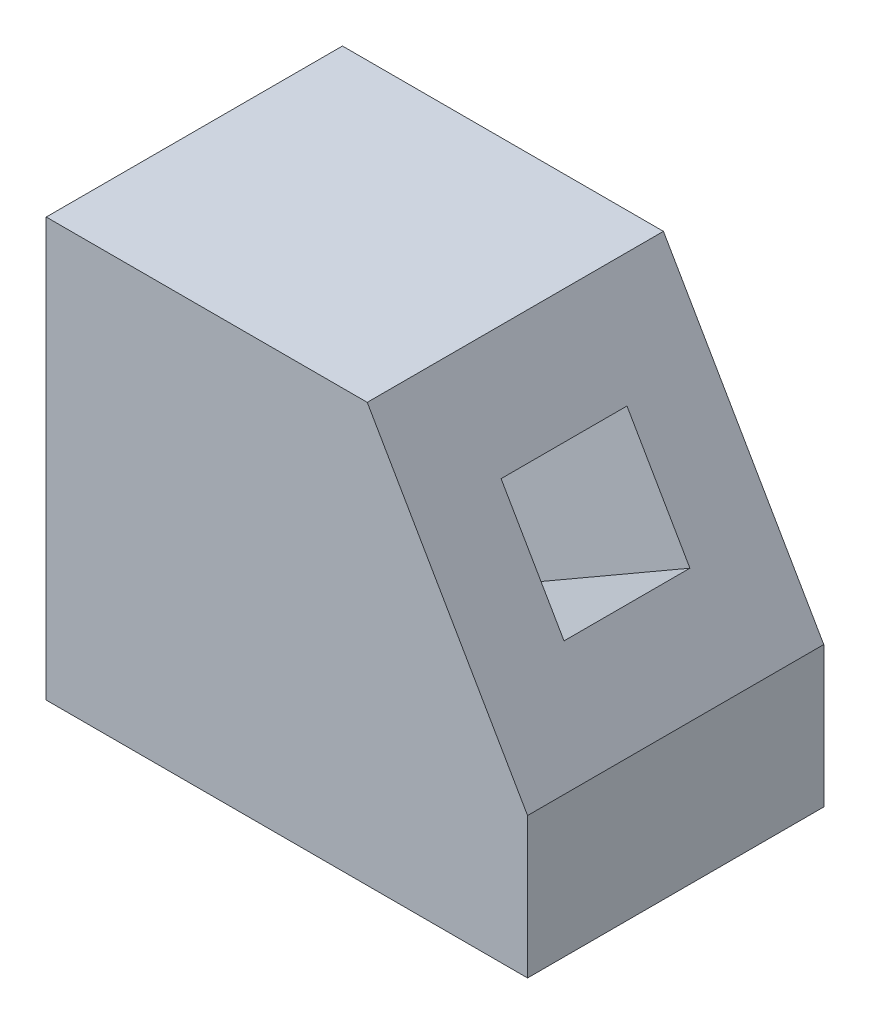
ISO-10303-21;
HEADER;
FILE_DESCRIPTION(('STEP AP214'),'2;1');
FILE_NAME('part.step','',(''),(''),'','','');
FILE_SCHEMA(('AUTOMOTIVE_DESIGN { 1 0 10303 214 1 1 1 1 }'));
ENDSEC;
DATA;
#1=APPLICATION_CONTEXT('core data for automotive mechanical design processes');
#2=APPLICATION_PROTOCOL_DEFINITION('international standard','automotive_design',2000,#1);
#3=PRODUCT_CONTEXT('',#1,'mechanical');
#4=PRODUCT('Part','Part','',(#3));
#5=PRODUCT_RELATED_PRODUCT_CATEGORY('part','',(#4));
#6=PRODUCT_DEFINITION_FORMATION('','',#4);
#7=PRODUCT_DEFINITION_CONTEXT('part definition',#1,'design');
#8=PRODUCT_DEFINITION('design','',#6,#7);
#9=PRODUCT_DEFINITION_SHAPE('','',#8);
#10=(LENGTH_UNIT() NAMED_UNIT(*) SI_UNIT(.MILLI.,.METRE.));
#11=(NAMED_UNIT(*) PLANE_ANGLE_UNIT() SI_UNIT($,.RADIAN.));
#12=(NAMED_UNIT(*) SI_UNIT($,.STERADIAN.) SOLID_ANGLE_UNIT());
#13=UNCERTAINTY_MEASURE_WITH_UNIT(LENGTH_MEASURE(1.E-05),#10,'distance_accuracy_value','');
#14=(GEOMETRIC_REPRESENTATION_CONTEXT(3) GLOBAL_UNCERTAINTY_ASSIGNED_CONTEXT((#13)) GLOBAL_UNIT_ASSIGNED_CONTEXT((#10,
#11,#12)) REPRESENTATION_CONTEXT('',''));
#15=CARTESIAN_POINT('',(0.,0.,0.));
#16=DIRECTION('',(0.,0.,1.));
#17=DIRECTION('',(1.,0.,0.));
#18=AXIS2_PLACEMENT_3D('',#15,#16,#17);
#19=CARTESIAN_POINT('',(0.,11.3,0.));
#20=DIRECTION('',(1.,0.,0.));
#21=DIRECTION('',(0.,0.,-1.));
#22=AXIS2_PLACEMENT_3D('',#19,#20,#21);
#23=PLANE('',#22);
#24=DIRECTION('',(0.,0.,1.));
#25=VECTOR('',#24,1.);
#26=CARTESIAN_POINT('',(0.,3.25743741577966,0.));
#27=LINE('',#26,#25);
#28=CARTESIAN_POINT('',(0.,3.25743741577966,-5.7));
#29=VERTEX_POINT('',#28);
#30=CARTESIAN_POINT('',(0.,3.25743741577966,-2.3));
#31=VERTEX_POINT('',#30);
#32=EDGE_CURVE('E148',#29,#31,#27,.T.);
#33=ORIENTED_EDGE('',*,*,#32,.T.);
#34=DIRECTION('',(0.,-1.,0.));
#35=VECTOR('',#34,1.);
#36=CARTESIAN_POINT('',(0.,11.3,-2.3));
#37=LINE('',#36,#35);
#38=CARTESIAN_POINT('',(0.,2.31666049839547,-2.3));
#39=VERTEX_POINT('',#38);
#40=EDGE_CURVE('E155',#31,#39,#37,.T.);
#41=ORIENTED_EDGE('',*,*,#40,.T.);
#42=DIRECTION('',(0.,0.,1.));
#43=VECTOR('',#42,1.);
#44=CARTESIAN_POINT('',(0.,2.31666049839547,0.));
#45=LINE('',#44,#43);
#46=CARTESIAN_POINT('',(0.,2.31666049839547,-5.7));
#47=VERTEX_POINT('',#46);
#48=EDGE_CURVE('E11',#47,#39,#45,.T.);
#49=ORIENTED_EDGE('',*,*,#48,.F.);
#50=DIRECTION('',(0.,1.,0.));
#51=VECTOR('',#50,1.);
#52=CARTESIAN_POINT('',(0.,11.3,-5.7));
#53=LINE('',#52,#51);
#54=EDGE_CURVE('E123',#47,#29,#53,.T.);
#55=ORIENTED_EDGE('',*,*,#54,.T.);
#56=EDGE_LOOP('',(#33,#41,#49,#55));
#57=FACE_BOUND('',#56,.T.);
#58=DIRECTION('',(0.,0.,1.));
#59=VECTOR('',#58,1.);
#60=CARTESIAN_POINT('',(0.,0.,0.));
#61=LINE('',#60,#59);
#62=CARTESIAN_POINT('',(0.,0.,-8.));
#63=VERTEX_POINT('',#62);
#64=CARTESIAN_POINT('',(0.,0.,0.));
#65=VERTEX_POINT('',#64);
#66=EDGE_CURVE('E165',#63,#65,#61,.T.);
#67=ORIENTED_EDGE('',*,*,#66,.T.);
#68=DIRECTION('',(0.,-1.,0.));
#69=VECTOR('',#68,1.);
#70=CARTESIAN_POINT('',(0.,11.3,0.));
#71=LINE('',#70,#69);
#72=CARTESIAN_POINT('',(0.,11.3,0.));
#73=VERTEX_POINT('',#72);
#74=EDGE_CURVE('E46',#73,#65,#71,.T.);
#75=ORIENTED_EDGE('',*,*,#74,.F.);
#76=DIRECTION('',(0.,0.,1.));
#77=VECTOR('',#76,1.);
#78=CARTESIAN_POINT('',(0.,11.3,0.));
#79=LINE('',#78,#77);
#80=CARTESIAN_POINT('',(0.,11.3,-8.));
#81=VERTEX_POINT('',#80);
#82=EDGE_CURVE('E164',#81,#73,#79,.T.);
#83=ORIENTED_EDGE('',*,*,#82,.F.);
#84=DIRECTION('',(0.,-1.,0.));
#85=VECTOR('',#84,1.);
#86=CARTESIAN_POINT('',(0.,11.3,-8.));
#87=LINE('',#86,#85);
#88=EDGE_CURVE('E172',#81,#63,#87,.T.);
#89=ORIENTED_EDGE('',*,*,#88,.T.);
#90=EDGE_LOOP('',(#67,#75,#83,#89));
#91=FACE_BOUND('',#90,.T.);
#92=ADVANCED_FACE('F39',(#57,#91),#23,.F.);
#93=CARTESIAN_POINT('',(0.,11.3,0.));
#94=DIRECTION('',(0.,0.,-1.));
#95=DIRECTION('',(-1.,0.,0.));
#96=AXIS2_PLACEMENT_3D('',#93,#94,#95);
#97=PLANE('',#96);
#98=DIRECTION('',(0.,-1.,0.));
#99=VECTOR('',#98,1.);
#100=CARTESIAN_POINT('',(13.,11.3,0.));
#101=LINE('',#100,#99);
#102=CARTESIAN_POINT('',(13.,3.8,0.));
#103=VERTEX_POINT('',#102);
#104=CARTESIAN_POINT('',(13.,0.,0.));
#105=VERTEX_POINT('',#104);
#106=EDGE_CURVE('E189',#103,#105,#101,.T.);
#107=ORIENTED_EDGE('',*,*,#106,.F.);
#108=DIRECTION('',(0.499999999999995,-0.866025403784442,0.));
#109=VECTOR('',#108,1.);
#110=CARTESIAN_POINT('',(13.,3.8,0.));
#111=LINE('',#110,#109);
#112=CARTESIAN_POINT('',(8.66987298107787,11.3,0.));
#113=VERTEX_POINT('',#112);
#114=EDGE_CURVE('E163',#113,#103,#111,.T.);
#115=ORIENTED_EDGE('',*,*,#114,.F.);
#116=DIRECTION('',(1.,0.,0.));
#117=VECTOR('',#116,1.);
#118=CARTESIAN_POINT('',(0.,11.3,0.));
#119=LINE('',#118,#117);
#120=EDGE_CURVE('E166',#73,#113,#119,.T.);
#121=ORIENTED_EDGE('',*,*,#120,.F.);
#122=ORIENTED_EDGE('',*,*,#74,.T.);
#123=DIRECTION('',(1.,0.,0.));
#124=VECTOR('',#123,1.);
#125=CARTESIAN_POINT('',(0.,0.,0.));
#126=LINE('',#125,#124);
#127=EDGE_CURVE('E180',#65,#105,#126,.T.);
#128=ORIENTED_EDGE('',*,*,#127,.T.);
#129=EDGE_LOOP('',(#107,#115,#121,#122,#128));
#130=FACE_BOUND('',#129,.T.);
#131=ADVANCED_FACE('F195',(#130),#97,.F.);
#132=CARTESIAN_POINT('',(13.,11.3,0.));
#133=DIRECTION('',(-1.,0.,0.));
#134=DIRECTION('',(0.,0.,1.));
#135=AXIS2_PLACEMENT_3D('',#132,#133,#134);
#136=PLANE('',#135);
#137=DIRECTION('',(0.,-1.,0.));
#138=VECTOR('',#137,1.);
#139=CARTESIAN_POINT('',(13.,11.3,-8.));
#140=LINE('',#139,#138);
#141=CARTESIAN_POINT('',(13.,3.8,-8.));
#142=VERTEX_POINT('',#141);
#143=CARTESIAN_POINT('',(13.,0.,-8.));
#144=VERTEX_POINT('',#143);
#145=EDGE_CURVE('E187',#142,#144,#140,.T.);
#146=ORIENTED_EDGE('',*,*,#145,.F.);
#147=DIRECTION('',(0.,0.,-1.));
#148=VECTOR('',#147,1.);
#149=CARTESIAN_POINT('',(13.,3.8,0.000999999999999265));
#150=LINE('',#149,#148);
#151=EDGE_CURVE('E160',#103,#142,#150,.T.);
#152=ORIENTED_EDGE('',*,*,#151,.F.);
#153=ORIENTED_EDGE('',*,*,#106,.T.);
#154=DIRECTION('',(0.,0.,-1.));
#155=VECTOR('',#154,1.);
#156=CARTESIAN_POINT('',(13.,0.,0.));
#157=LINE('',#156,#155);
#158=EDGE_CURVE('E179',#105,#144,#157,.T.);
#159=ORIENTED_EDGE('',*,*,#158,.T.);
#160=EDGE_LOOP('',(#146,#152,#153,#159));
#161=FACE_BOUND('',#160,.T.);
#162=ADVANCED_FACE('F204',(#161),#136,.F.);
#163=CARTESIAN_POINT('',(0.,11.3,-8.));
#164=DIRECTION('',(0.,0.,1.));
#165=DIRECTION('',(1.,0.,0.));
#166=AXIS2_PLACEMENT_3D('',#163,#164,#165);
#167=PLANE('',#166);
#168=DIRECTION('',(-1.,0.,0.));
#169=VECTOR('',#168,1.);
#170=CARTESIAN_POINT('',(0.,11.3,-8.));
#171=LINE('',#170,#169);
#172=CARTESIAN_POINT('',(8.66987298107786,11.3,-8.));
#173=VERTEX_POINT('',#172);
#174=EDGE_CURVE('E175',#173,#81,#171,.T.);
#175=ORIENTED_EDGE('',*,*,#174,.F.);
#176=DIRECTION('',(-0.499999999999995,0.866025403784442,0.));
#177=VECTOR('',#176,1.);
#178=CARTESIAN_POINT('',(13.,3.8,-8.));
#179=LINE('',#178,#177);
#180=EDGE_CURVE('E154',#142,#173,#179,.T.);
#181=ORIENTED_EDGE('',*,*,#180,.F.);
#182=ORIENTED_EDGE('',*,*,#145,.T.);
#183=DIRECTION('',(-1.,0.,0.));
#184=VECTOR('',#183,1.);
#185=CARTESIAN_POINT('',(0.,0.,-8.));
#186=LINE('',#185,#184);
#187=EDGE_CURVE('E169',#144,#63,#186,.T.);
#188=ORIENTED_EDGE('',*,*,#187,.T.);
#189=ORIENTED_EDGE('',*,*,#88,.F.);
#190=EDGE_LOOP('',(#175,#181,#182,#188,#189));
#191=FACE_BOUND('',#190,.T.);
#192=ADVANCED_FACE('F215',(#191),#167,.F.);
#193=CARTESIAN_POINT('',(0.,11.3,0.));
#194=DIRECTION('',(0.,-1.,0.));
#195=DIRECTION('',(0.,0.,-1.));
#196=AXIS2_PLACEMENT_3D('',#193,#194,#195);
#197=PLANE('',#196);
#198=ORIENTED_EDGE('',*,*,#120,.T.);
#199=DIRECTION('',(0.,0.,-1.));
#200=VECTOR('',#199,1.);
#201=CARTESIAN_POINT('',(8.66987298107787,11.3,0.000999999999999265));
#202=LINE('',#201,#200);
#203=EDGE_CURVE('E156',#113,#173,#202,.T.);
#204=ORIENTED_EDGE('',*,*,#203,.T.);
#205=ORIENTED_EDGE('',*,*,#174,.T.);
#206=ORIENTED_EDGE('',*,*,#82,.T.);
#207=EDGE_LOOP('',(#198,#204,#205,#206));
#208=FACE_BOUND('',#207,.T.);
#209=ADVANCED_FACE('F209',(#208),#197,.F.);
#210=CARTESIAN_POINT('',(0.,0.,0.));
#211=DIRECTION('',(0.,-1.,0.));
#212=DIRECTION('',(0.,0.,-1.));
#213=AXIS2_PLACEMENT_3D('',#210,#211,#212);
#214=PLANE('',#213);
#215=ORIENTED_EDGE('',*,*,#66,.F.);
#216=ORIENTED_EDGE('',*,*,#187,.F.);
#217=ORIENTED_EDGE('',*,*,#158,.F.);
#218=ORIENTED_EDGE('',*,*,#127,.F.);
#219=EDGE_LOOP('',(#215,#216,#217,#218));
#220=FACE_BOUND('',#219,.T.);
#221=ADVANCED_FACE('F205',(#220),#214,.T.);
#222=CARTESIAN_POINT('',(13.,3.8,0.000999999999999265));
#223=DIRECTION('',(-0.866025403784442,-0.499999999999995,0.));
#224=DIRECTION('',(0.499999999999995,-0.866025403784442,0.));
#225=AXIS2_PLACEMENT_3D('',#222,#223,#224);
#226=PLANE('',#225);
#227=DIRECTION('',(-0.499999999999995,0.866025403784441,0.));
#228=VECTOR('',#227,1.);
#229=CARTESIAN_POINT('',(9.98493649053894,9.02224318643355,-5.7));
#230=LINE('',#229,#228);
#231=CARTESIAN_POINT('',(11.6849364905389,6.07775681356645,-5.7));
#232=VERTEX_POINT('',#231);
#233=CARTESIAN_POINT('',(9.98493649053894,9.02224318643355,-5.7));
#234=VERTEX_POINT('',#233);
#235=EDGE_CURVE('E137',#232,#234,#230,.T.);
#236=ORIENTED_EDGE('',*,*,#235,.F.);
#237=DIRECTION('',(0.,0.,-1.));
#238=VECTOR('',#237,1.);
#239=CARTESIAN_POINT('',(11.6849364905389,6.07775681356645,-5.7));
#240=LINE('',#239,#238);
#241=CARTESIAN_POINT('',(11.6849364905389,6.07775681356645,-2.3));
#242=VERTEX_POINT('',#241);
#243=EDGE_CURVE('E58',#242,#232,#240,.T.);
#244=ORIENTED_EDGE('',*,*,#243,.F.);
#245=DIRECTION('',(0.499999999999995,-0.866025403784441,0.));
#246=VECTOR('',#245,1.);
#247=CARTESIAN_POINT('',(9.98493649053894,9.02224318643355,-2.3));
#248=LINE('',#247,#246);
#249=CARTESIAN_POINT('',(9.98493649053894,9.02224318643355,-2.3));
#250=VERTEX_POINT('',#249);
#251=EDGE_CURVE('E131',#250,#242,#248,.T.);
#252=ORIENTED_EDGE('',*,*,#251,.F.);
#253=DIRECTION('',(0.,0.,1.));
#254=VECTOR('',#253,1.);
#255=CARTESIAN_POINT('',(9.98493649053894,9.02224318643355,-5.7));
#256=LINE('',#255,#254);
#257=EDGE_CURVE('E132',#234,#250,#256,.T.);
#258=ORIENTED_EDGE('',*,*,#257,.F.);
#259=EDGE_LOOP('',(#236,#244,#252,#258));
#260=FACE_BOUND('',#259,.T.);
#261=ORIENTED_EDGE('',*,*,#114,.T.);
#262=ORIENTED_EDGE('',*,*,#151,.T.);
#263=ORIENTED_EDGE('',*,*,#180,.T.);
#264=ORIENTED_EDGE('',*,*,#203,.F.);
#265=EDGE_LOOP('',(#261,#262,#263,#264));
#266=FACE_BOUND('',#265,.T.);
#267=ADVANCED_FACE('F213',(#260,#266),#226,.F.);
#268=CARTESIAN_POINT('',(1.00314342177719,0.579165124598859,0.));
#269=DIRECTION('',(0.866025403784441,0.499999999999995,0.));
#270=DIRECTION('',(-0.499999999999995,0.866025403784441,0.));
#271=AXIS2_PLACEMENT_3D('',#268,#269,#270);
#272=PLANE('',#271);
#273=ORIENTED_EDGE('',*,*,#48,.T.);
#274=DIRECTION('',(0.499999999999995,-0.866025403784441,0.));
#275=VECTOR('',#274,1.);
#276=CARTESIAN_POINT('',(-0.407368354874356,3.02224318643362,-2.3));
#277=LINE('',#276,#275);
#278=CARTESIAN_POINT('',(1.29263164512563,0.0777568135665154,-2.3));
#279=VERTEX_POINT('',#278);
#280=EDGE_CURVE('E119',#39,#279,#277,.T.);
#281=ORIENTED_EDGE('',*,*,#280,.T.);
#282=DIRECTION('',(0.,0.,-1.));
#283=VECTOR('',#282,1.);
#284=CARTESIAN_POINT('',(1.29263164512563,0.0777568135665154,-5.7));
#285=LINE('',#284,#283);
#286=CARTESIAN_POINT('',(1.29263164512563,0.0777568135665154,-5.7));
#287=VERTEX_POINT('',#286);
#288=EDGE_CURVE('E114',#279,#287,#285,.T.);
#289=ORIENTED_EDGE('',*,*,#288,.T.);
#290=DIRECTION('',(-0.499999999999995,0.866025403784441,0.));
#291=VECTOR('',#290,1.);
#292=CARTESIAN_POINT('',(-0.407368354874356,3.02224318643362,-5.7));
#293=LINE('',#292,#291);
#294=EDGE_CURVE('E55',#287,#47,#293,.T.);
#295=ORIENTED_EDGE('',*,*,#294,.T.);
#296=EDGE_LOOP('',(#273,#281,#289,#295));
#297=FACE_BOUND('',#296,.T.);
#298=ADVANCED_FACE('F130',(#297),#272,.T.);
#299=CARTESIAN_POINT('',(-0.407368354874356,3.02224318643362,-2.3));
#300=DIRECTION('',(0.,0.,1.));
#301=DIRECTION('',(1.,0.,0.));
#302=AXIS2_PLACEMENT_3D('',#299,#300,#301);
#303=PLANE('',#302);
#304=DIRECTION('',(0.866025403784442,0.499999999999995,0.));
#305=VECTOR('',#304,1.);
#306=CARTESIAN_POINT('',(-0.407368354874356,3.02224318643362,-2.3));
#307=LINE('',#306,#305);
#308=EDGE_CURVE('E143',#31,#250,#307,.T.);
#309=ORIENTED_EDGE('',*,*,#308,.T.);
#310=ORIENTED_EDGE('',*,*,#251,.T.);
#311=DIRECTION('',(0.866025403784442,0.499999999999995,0.));
#312=VECTOR('',#311,1.);
#313=CARTESIAN_POINT('',(1.29263164512563,0.0777568135665154,-2.3));
#314=LINE('',#313,#312);
#315=EDGE_CURVE('E141',#279,#242,#314,.T.);
#316=ORIENTED_EDGE('',*,*,#315,.F.);
#317=ORIENTED_EDGE('',*,*,#280,.F.);
#318=ORIENTED_EDGE('',*,*,#40,.F.);
#319=EDGE_LOOP('',(#309,#310,#316,#317,#318));
#320=FACE_BOUND('',#319,.T.);
#321=ADVANCED_FACE('F225',(#320),#303,.F.);
#322=CARTESIAN_POINT('',(-0.407368354874356,3.02224318643362,-5.7));
#323=DIRECTION('',(-0.499999999999995,0.866025403784442,0.));
#324=DIRECTION('',(-0.866025403784442,-0.499999999999995,0.));
#325=AXIS2_PLACEMENT_3D('',#322,#323,#324);
#326=PLANE('',#325);
#327=DIRECTION('',(0.866025403784442,0.499999999999995,0.));
#328=VECTOR('',#327,1.);
#329=CARTESIAN_POINT('',(-0.407368354874356,3.02224318643362,-5.7));
#330=LINE('',#329,#328);
#331=EDGE_CURVE('E118',#29,#234,#330,.T.);
#332=ORIENTED_EDGE('',*,*,#331,.T.);
#333=ORIENTED_EDGE('',*,*,#257,.T.);
#334=ORIENTED_EDGE('',*,*,#308,.F.);
#335=ORIENTED_EDGE('',*,*,#32,.F.);
#336=EDGE_LOOP('',(#332,#333,#334,#335));
#337=FACE_BOUND('',#336,.T.);
#338=ADVANCED_FACE('F232',(#337),#326,.F.);
#339=CARTESIAN_POINT('',(-0.407368354874356,3.02224318643362,-5.7));
#340=DIRECTION('',(0.,0.,-1.));
#341=DIRECTION('',(-1.,0.,0.));
#342=AXIS2_PLACEMENT_3D('',#339,#340,#341);
#343=PLANE('',#342);
#344=ORIENTED_EDGE('',*,*,#294,.F.);
#345=DIRECTION('',(0.866025403784442,0.499999999999995,0.));
#346=VECTOR('',#345,1.);
#347=CARTESIAN_POINT('',(1.29263164512563,0.0777568135665154,-5.7));
#348=LINE('',#347,#346);
#349=EDGE_CURVE('E113',#287,#232,#348,.T.);
#350=ORIENTED_EDGE('',*,*,#349,.T.);
#351=ORIENTED_EDGE('',*,*,#235,.T.);
#352=ORIENTED_EDGE('',*,*,#331,.F.);
#353=ORIENTED_EDGE('',*,*,#54,.F.);
#354=EDGE_LOOP('',(#344,#350,#351,#352,#353));
#355=FACE_BOUND('',#354,.T.);
#356=ADVANCED_FACE('F125',(#355),#343,.F.);
#357=CARTESIAN_POINT('',(1.29263164512563,0.0777568135665154,-5.7));
#358=DIRECTION('',(0.499999999999995,-0.866025403784442,0.));
#359=DIRECTION('',(0.866025403784442,0.499999999999995,0.));
#360=AXIS2_PLACEMENT_3D('',#357,#358,#359);
#361=PLANE('',#360);
#362=ORIENTED_EDGE('',*,*,#243,.T.);
#363=ORIENTED_EDGE('',*,*,#349,.F.);
#364=ORIENTED_EDGE('',*,*,#288,.F.);
#365=ORIENTED_EDGE('',*,*,#315,.T.);
#366=EDGE_LOOP('',(#362,#363,#364,#365));
#367=FACE_BOUND('',#366,.T.);
#368=ADVANCED_FACE('F112',(#367),#361,.F.);
#369=CLOSED_SHELL('',(#92,#131,#162,#192,#209,#221,#267,#298,#321,#338,#356,#368));
#370=MANIFOLD_SOLID_BREP('B2',#369);
#371=ADVANCED_BREP_SHAPE_REPRESENTATION('',(#18,#370),#14);
#372=SHAPE_DEFINITION_REPRESENTATION(#9,#371);
ENDSEC;
END-ISO-10303-21;
